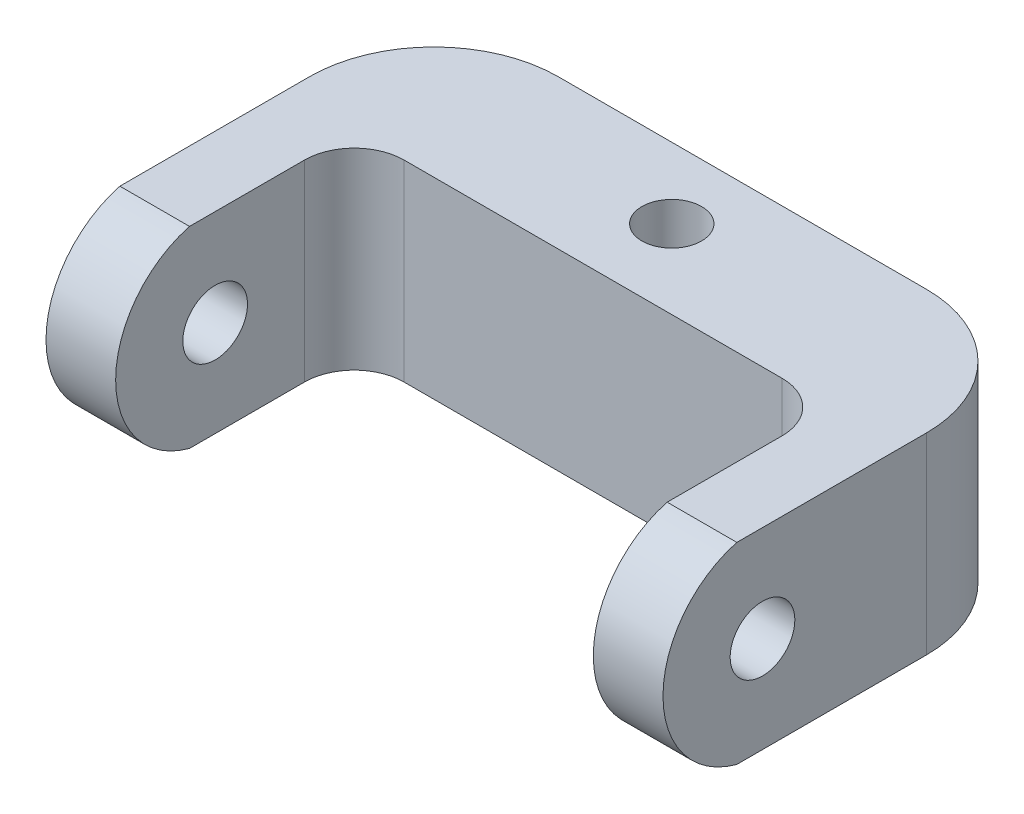
ISO-10303-21;
HEADER;
FILE_DESCRIPTION(('STEP AP214'),'2;1');
FILE_NAME('part.step','',(''),(''),'','','');
FILE_SCHEMA(('AUTOMOTIVE_DESIGN { 1 0 10303 214 1 1 1 1 }'));
ENDSEC;
DATA;
#1=APPLICATION_CONTEXT('core data for automotive mechanical design processes');
#2=APPLICATION_PROTOCOL_DEFINITION('international standard','automotive_design',2000,#1);
#3=PRODUCT_CONTEXT('',#1,'mechanical');
#4=PRODUCT('Part','Part','',(#3));
#5=PRODUCT_RELATED_PRODUCT_CATEGORY('part','',(#4));
#6=PRODUCT_DEFINITION_FORMATION('','',#4);
#7=PRODUCT_DEFINITION_CONTEXT('part definition',#1,'design');
#8=PRODUCT_DEFINITION('design','',#6,#7);
#9=PRODUCT_DEFINITION_SHAPE('','',#8);
#10=(LENGTH_UNIT() NAMED_UNIT(*) SI_UNIT(.MILLI.,.METRE.));
#11=(NAMED_UNIT(*) PLANE_ANGLE_UNIT() SI_UNIT($,.RADIAN.));
#12=(NAMED_UNIT(*) SI_UNIT($,.STERADIAN.) SOLID_ANGLE_UNIT());
#13=UNCERTAINTY_MEASURE_WITH_UNIT(LENGTH_MEASURE(1.E-05),#10,'distance_accuracy_value','');
#14=(GEOMETRIC_REPRESENTATION_CONTEXT(3) GLOBAL_UNCERTAINTY_ASSIGNED_CONTEXT((#13)) GLOBAL_UNIT_ASSIGNED_CONTEXT((#10,
#11,#12)) REPRESENTATION_CONTEXT('',''));
#15=CARTESIAN_POINT('',(0.,0.,0.));
#16=DIRECTION('',(0.,0.,1.));
#17=DIRECTION('',(1.,0.,0.));
#18=AXIS2_PLACEMENT_3D('',#15,#16,#17);
#19=CARTESIAN_POINT('',(21.,88.6760866086448,9.55618540610377));
#20=DIRECTION('',(0.,-1.,0.));
#21=DIRECTION('',(0.,0.,-1.));
#22=AXIS2_PLACEMENT_3D('',#19,#20,#21);
#23=PLANE('',#22);
#24=CARTESIAN_POINT('',(-3.,88.6760866086448,-14.9032500194833));
#25=DIRECTION('',(0.,1.,0.));
#26=DIRECTION('',(-1.,0.,0.));
#27=AXIS2_PLACEMENT_3D('',#24,#25,#26);
#28=CIRCLE('',#27,3.);
#29=CARTESIAN_POINT('',(0.,88.6760866086448,-14.9032500194833));
#30=VERTEX_POINT('',#29);
#31=EDGE_CURVE('E169',#30,#30,#28,.T.);
#32=ORIENTED_EDGE('',*,*,#31,.T.);
#33=EDGE_LOOP('',(#32));
#34=FACE_BOUND('',#33,.T.);
#35=CARTESIAN_POINT('',(-21.5,88.6760866086448,-9.50000010430813));
#36=DIRECTION('',(0.,1.,0.));
#37=DIRECTION('',(-0.707106781186548,0.,-0.707106781186548));
#38=AXIS2_PLACEMENT_3D('',#35,#36,#37);
#39=CIRCLE('',#38,12.5);
#40=CARTESIAN_POINT('',(-21.5,88.6760866086448,-22.0000001043081));
#41=VERTEX_POINT('',#40);
#42=CARTESIAN_POINT('',(-34.,88.6760866086448,-9.50000010430813));
#43=VERTEX_POINT('',#42);
#44=EDGE_CURVE('E162',#41,#43,#39,.T.);
#45=ORIENTED_EDGE('',*,*,#44,.F.);
#46=DIRECTION('',(1.,0.,0.));
#47=VECTOR('',#46,1.);
#48=CARTESIAN_POINT('',(21.,88.6760866086448,-22.0000001043081));
#49=LINE('',#48,#47);
#50=CARTESIAN_POINT('',(15.5,88.6760866086448,-22.0000001043081));
#51=VERTEX_POINT('',#50);
#52=EDGE_CURVE('E154',#41,#51,#49,.T.);
#53=ORIENTED_EDGE('',*,*,#52,.T.);
#54=CARTESIAN_POINT('',(15.5,88.6760866086448,-9.50000010430813));
#55=DIRECTION('',(0.,1.,0.));
#56=DIRECTION('',(0.707106781186548,0.,-0.707106781186548));
#57=AXIS2_PLACEMENT_3D('',#54,#55,#56);
#58=CIRCLE('',#57,12.5);
#59=CARTESIAN_POINT('',(28.,88.6760866086448,-9.50000010430813));
#60=VERTEX_POINT('',#59);
#61=EDGE_CURVE('E252',#60,#51,#58,.T.);
#62=ORIENTED_EDGE('',*,*,#61,.F.);
#63=DIRECTION('',(0.,0.,-1.));
#64=VECTOR('',#63,1.);
#65=CARTESIAN_POINT('',(28.,88.6760866086448,7.27261511207016));
#66=LINE('',#65,#64);
#67=CARTESIAN_POINT('',(28.,88.6760866086448,9.55618540610377));
#68=VERTEX_POINT('',#67);
#69=EDGE_CURVE('E113',#68,#60,#66,.T.);
#70=ORIENTED_EDGE('',*,*,#69,.F.);
#71=DIRECTION('',(1.,0.,0.));
#72=VECTOR('',#71,1.);
#73=CARTESIAN_POINT('',(21.,88.6760866086448,9.55618540610377));
#74=LINE('',#73,#72);
#75=CARTESIAN_POINT('',(21.,88.6760866086448,9.55618540610377));
#76=VERTEX_POINT('',#75);
#77=EDGE_CURVE('E46',#76,#68,#74,.T.);
#78=ORIENTED_EDGE('',*,*,#77,.F.);
#79=DIRECTION('',(0.,0.,1.));
#80=VECTOR('',#79,1.);
#81=CARTESIAN_POINT('',(21.,88.6760866086448,-7.00000010430813));
#82=LINE('',#81,#80);
#83=CARTESIAN_POINT('',(21.,88.6760866086448,-2.00000010430813));
#84=VERTEX_POINT('',#83);
#85=EDGE_CURVE('E227',#84,#76,#82,.T.);
#86=ORIENTED_EDGE('',*,*,#85,.F.);
#87=CARTESIAN_POINT('',(16.,88.6760866086448,-2.00000010430813));
#88=DIRECTION('',(0.,-1.,0.));
#89=DIRECTION('',(0.707106781186548,0.,-0.707106781186548));
#90=AXIS2_PLACEMENT_3D('',#87,#88,#89);
#91=CIRCLE('',#90,5.);
#92=CARTESIAN_POINT('',(16.,88.6760866086448,-7.00000010430813));
#93=VERTEX_POINT('',#92);
#94=EDGE_CURVE('E187',#93,#84,#91,.T.);
#95=ORIENTED_EDGE('',*,*,#94,.F.);
#96=DIRECTION('',(-1.,0.,0.));
#97=VECTOR('',#96,1.);
#98=CARTESIAN_POINT('',(9.,88.6760866086448,-7.00000010430813));
#99=LINE('',#98,#97);
#100=CARTESIAN_POINT('',(-22.,88.6760866086448,-7.00000010430813));
#101=VERTEX_POINT('',#100);
#102=EDGE_CURVE('E203',#93,#101,#99,.T.);
#103=ORIENTED_EDGE('',*,*,#102,.T.);
#104=CARTESIAN_POINT('',(-22.,88.6760866086448,-2.00000010430813));
#105=DIRECTION('',(0.,-1.,0.));
#106=DIRECTION('',(-0.707106781186548,0.,-0.707106781186548));
#107=AXIS2_PLACEMENT_3D('',#104,#105,#106);
#108=CIRCLE('',#107,5.);
#109=CARTESIAN_POINT('',(-27.,88.6760866086448,-2.00000010430813));
#110=VERTEX_POINT('',#109);
#111=EDGE_CURVE('E243',#110,#101,#108,.T.);
#112=ORIENTED_EDGE('',*,*,#111,.F.);
#113=DIRECTION('',(0.,0.,1.));
#114=VECTOR('',#113,1.);
#115=CARTESIAN_POINT('',(-27.,88.6760866086448,-7.00000010430813));
#116=LINE('',#115,#114);
#117=CARTESIAN_POINT('',(-27.,88.6760866086448,9.55618540610377));
#118=VERTEX_POINT('',#117);
#119=EDGE_CURVE('E181',#110,#118,#116,.T.);
#120=ORIENTED_EDGE('',*,*,#119,.T.);
#121=DIRECTION('',(-1.,0.,0.));
#122=VECTOR('',#121,1.);
#123=CARTESIAN_POINT('',(-27.,88.6760866086448,9.55618540610377));
#124=LINE('',#123,#122);
#125=CARTESIAN_POINT('',(-34.,88.6760866086448,9.55618540610377));
#126=VERTEX_POINT('',#125);
#127=EDGE_CURVE('E205',#118,#126,#124,.T.);
#128=ORIENTED_EDGE('',*,*,#127,.T.);
#129=DIRECTION('',(0.,0.,-1.));
#130=VECTOR('',#129,1.);
#131=CARTESIAN_POINT('',(-34.,88.6760866086448,7.27261511207016));
#132=LINE('',#131,#130);
#133=EDGE_CURVE('E228',#126,#43,#132,.T.);
#134=ORIENTED_EDGE('',*,*,#133,.T.);
#135=EDGE_LOOP('',(#45,#53,#62,#70,#78,#86,#95,#103,#112,#120,#128,#134));
#136=FACE_BOUND('',#135,.T.);
#137=ADVANCED_FACE('F36',(#34,#136),#23,.T.);
#138=CARTESIAN_POINT('',(21.,98.3380441089851,6.97808974038122));
#139=DIRECTION('',(1.,0.,0.));
#140=DIRECTION('',(0.,1.,0.));
#141=AXIS2_PLACEMENT_3D('',#138,#139,#140);
#142=CYLINDRICAL_SURFACE('',#141,3.25);
#143=CARTESIAN_POINT('',(28.,98.3380441089851,6.97808974038122));
#144=DIRECTION('',(-1.,0.,0.));
#145=DIRECTION('',(0.,1.,0.));
#146=AXIS2_PLACEMENT_3D('',#143,#144,#145);
#147=CIRCLE('',#146,3.25);
#148=CARTESIAN_POINT('',(28.,95.0880441089851,6.97808974038122));
#149=VERTEX_POINT('',#148);
#150=EDGE_CURVE('E40',#149,#149,#147,.T.);
#151=ORIENTED_EDGE('',*,*,#150,.F.);
#152=DIRECTION('',(-1.,0.,0.));
#153=VECTOR('',#152,1.);
#154=CARTESIAN_POINT('',(21.,95.0880441089851,6.97808974038122));
#155=LINE('',#154,#153);
#156=CARTESIAN_POINT('',(21.,95.0880441089851,6.97808974038122));
#157=VERTEX_POINT('',#156);
#158=EDGE_CURVE('E11',#149,#157,#155,.T.);
#159=ORIENTED_EDGE('',*,*,#158,.T.);
#160=CARTESIAN_POINT('',(21.,98.3380441089851,6.97808974038122));
#161=DIRECTION('',(-1.,0.,0.));
#162=DIRECTION('',(0.,1.,0.));
#163=AXIS2_PLACEMENT_3D('',#160,#161,#162);
#164=CIRCLE('',#163,3.25);
#165=EDGE_CURVE('E226',#157,#157,#164,.T.);
#166=ORIENTED_EDGE('',*,*,#165,.T.);
#167=ORIENTED_EDGE('',*,*,#158,.F.);
#168=EDGE_LOOP('',(#151,#159,#166,#167));
#169=FACE_BOUND('',#168,.T.);
#170=ADVANCED_FACE('F303',(#169),#142,.F.);
#171=CARTESIAN_POINT('',(21.,98.3380441089851,6.97808974038122));
#172=DIRECTION('',(1.,0.,0.));
#173=DIRECTION('',(0.,1.,0.));
#174=AXIS2_PLACEMENT_3D('',#171,#172,#173);
#175=CYLINDRICAL_SURFACE('',#174,10.);
#176=CARTESIAN_POINT('',(21.,98.3380441089851,6.97808974038122));
#177=DIRECTION('',(1.,0.,0.));
#178=DIRECTION('',(0.,1.,0.));
#179=AXIS2_PLACEMENT_3D('',#176,#177,#178);
#180=CIRCLE('',#179,10.);
#181=CARTESIAN_POINT('',(21.,108.000001609325,9.55618540610376));
#182=VERTEX_POINT('',#181);
#183=EDGE_CURVE('E223',#182,#76,#180,.T.);
#184=ORIENTED_EDGE('',*,*,#183,.T.);
#185=ORIENTED_EDGE('',*,*,#77,.T.);
#186=CARTESIAN_POINT('',(28.,98.3380441089851,6.97808974038122));
#187=DIRECTION('',(1.,0.,0.));
#188=DIRECTION('',(0.,1.,0.));
#189=AXIS2_PLACEMENT_3D('',#186,#187,#188);
#190=CIRCLE('',#189,10.);
#191=CARTESIAN_POINT('',(28.,108.000001609325,9.55618540610376));
#192=VERTEX_POINT('',#191);
#193=EDGE_CURVE('E124',#192,#68,#190,.T.);
#194=ORIENTED_EDGE('',*,*,#193,.F.);
#195=DIRECTION('',(1.,0.,0.));
#196=VECTOR('',#195,1.);
#197=CARTESIAN_POINT('',(21.,108.000001609325,9.55618540610376));
#198=LINE('',#197,#196);
#199=EDGE_CURVE('E184',#182,#192,#198,.T.);
#200=ORIENTED_EDGE('',*,*,#199,.F.);
#201=EDGE_LOOP('',(#184,#185,#194,#200));
#202=FACE_BOUND('',#201,.T.);
#203=ADVANCED_FACE('F286',(#202),#175,.T.);
#204=CARTESIAN_POINT('',(-3.,98.3380441089851,-7.00000010430813));
#205=DIRECTION('',(0.,0.,-1.));
#206=DIRECTION('',(0.,-1.,0.));
#207=AXIS2_PLACEMENT_3D('',#204,#205,#206);
#208=PLANE('',#207);
#209=DIRECTION('',(0.,-1.,0.));
#210=VECTOR('',#209,1.);
#211=CARTESIAN_POINT('',(16.,98.3380441089851,-7.00000010430813));
#212=LINE('',#211,#210);
#213=CARTESIAN_POINT('',(16.,108.000001609325,-7.00000010430813));
#214=VERTEX_POINT('',#213);
#215=EDGE_CURVE('E197',#214,#93,#212,.T.);
#216=ORIENTED_EDGE('',*,*,#215,.F.);
#217=DIRECTION('',(1.,0.,0.));
#218=VECTOR('',#217,1.);
#219=CARTESIAN_POINT('',(9.,108.000001609325,-7.00000010430813));
#220=LINE('',#219,#218);
#221=CARTESIAN_POINT('',(-22.,108.000001609325,-7.00000010430813));
#222=VERTEX_POINT('',#221);
#223=EDGE_CURVE('E217',#222,#214,#220,.T.);
#224=ORIENTED_EDGE('',*,*,#223,.F.);
#225=DIRECTION('',(0.,1.,0.));
#226=VECTOR('',#225,1.);
#227=CARTESIAN_POINT('',(-22.,98.3380441089851,-7.00000010430813));
#228=LINE('',#227,#226);
#229=EDGE_CURVE('E176',#101,#222,#228,.T.);
#230=ORIENTED_EDGE('',*,*,#229,.F.);
#231=ORIENTED_EDGE('',*,*,#102,.F.);
#232=EDGE_LOOP('',(#216,#224,#230,#231));
#233=FACE_BOUND('',#232,.T.);
#234=ADVANCED_FACE('F278',(#233),#208,.F.);
#235=CARTESIAN_POINT('',(-27.,98.3380441089851,6.97808974038122));
#236=DIRECTION('',(1.,0.,0.));
#237=DIRECTION('',(0.,1.,0.));
#238=AXIS2_PLACEMENT_3D('',#235,#236,#237);
#239=CYLINDRICAL_SURFACE('',#238,3.25);
#240=CARTESIAN_POINT('',(-34.,98.3380441089851,6.97808974038122));
#241=DIRECTION('',(-1.,0.,0.));
#242=DIRECTION('',(0.,1.,0.));
#243=AXIS2_PLACEMENT_3D('',#240,#241,#242);
#244=CIRCLE('',#243,3.25);
#245=CARTESIAN_POINT('',(-34.,95.0880441089851,6.97808974038122));
#246=VERTEX_POINT('',#245);
#247=EDGE_CURVE('E191',#246,#246,#244,.T.);
#248=ORIENTED_EDGE('',*,*,#247,.T.);
#249=DIRECTION('',(1.,0.,0.));
#250=VECTOR('',#249,1.);
#251=CARTESIAN_POINT('',(-27.,95.0880441089851,6.97808974038122));
#252=LINE('',#251,#250);
#253=CARTESIAN_POINT('',(-27.,95.0880441089851,6.97808974038122));
#254=VERTEX_POINT('',#253);
#255=EDGE_CURVE('E55',#246,#254,#252,.T.);
#256=ORIENTED_EDGE('',*,*,#255,.T.);
#257=CARTESIAN_POINT('',(-27.,98.3380441089851,6.97808974038122));
#258=DIRECTION('',(-1.,0.,0.));
#259=DIRECTION('',(0.,1.,0.));
#260=AXIS2_PLACEMENT_3D('',#257,#258,#259);
#261=CIRCLE('',#260,3.25);
#262=EDGE_CURVE('E201',#254,#254,#261,.T.);
#263=ORIENTED_EDGE('',*,*,#262,.F.);
#264=ORIENTED_EDGE('',*,*,#255,.F.);
#265=EDGE_LOOP('',(#248,#256,#263,#264));
#266=FACE_BOUND('',#265,.T.);
#267=ADVANCED_FACE('F319',(#266),#239,.F.);
#268=CARTESIAN_POINT('',(-27.,98.3380441089851,6.97808974038122));
#269=DIRECTION('',(1.,0.,0.));
#270=DIRECTION('',(0.,1.,0.));
#271=AXIS2_PLACEMENT_3D('',#268,#269,#270);
#272=CYLINDRICAL_SURFACE('',#271,10.);
#273=CARTESIAN_POINT('',(-27.,98.3380441089851,6.97808974038122));
#274=DIRECTION('',(1.,0.,0.));
#275=DIRECTION('',(0.,1.,0.));
#276=AXIS2_PLACEMENT_3D('',#273,#274,#275);
#277=CIRCLE('',#276,10.);
#278=CARTESIAN_POINT('',(-27.,108.000001609325,9.55618540610376));
#279=VERTEX_POINT('',#278);
#280=EDGE_CURVE('E178',#279,#118,#277,.T.);
#281=ORIENTED_EDGE('',*,*,#280,.F.);
#282=DIRECTION('',(-1.,0.,0.));
#283=VECTOR('',#282,1.);
#284=CARTESIAN_POINT('',(-27.,108.000001609325,9.55618540610376));
#285=LINE('',#284,#283);
#286=CARTESIAN_POINT('',(-34.,108.000001609325,9.55618540610376));
#287=VERTEX_POINT('',#286);
#288=EDGE_CURVE('E153',#279,#287,#285,.T.);
#289=ORIENTED_EDGE('',*,*,#288,.T.);
#290=CARTESIAN_POINT('',(-34.,98.3380441089851,6.97808974038122));
#291=DIRECTION('',(1.,0.,0.));
#292=DIRECTION('',(0.,1.,0.));
#293=AXIS2_PLACEMENT_3D('',#290,#291,#292);
#294=CIRCLE('',#293,10.);
#295=EDGE_CURVE('E148',#287,#126,#294,.T.);
#296=ORIENTED_EDGE('',*,*,#295,.T.);
#297=ORIENTED_EDGE('',*,*,#127,.F.);
#298=EDGE_LOOP('',(#281,#289,#296,#297));
#299=FACE_BOUND('',#298,.T.);
#300=ADVANCED_FACE('F322',(#299),#272,.T.);
#301=CARTESIAN_POINT('',(-27.,98.3380441089851,4.98904481803654));
#302=DIRECTION('',(1.,0.,0.));
#303=DIRECTION('',(0.,1.,0.));
#304=AXIS2_PLACEMENT_3D('',#301,#302,#303);
#305=PLANE('',#304);
#306=ORIENTED_EDGE('',*,*,#262,.T.);
#307=EDGE_LOOP('',(#306));
#308=FACE_BOUND('',#307,.T.);
#309=DIRECTION('',(0.,-1.,0.));
#310=VECTOR('',#309,1.);
#311=CARTESIAN_POINT('',(-27.,98.3380441089851,-2.00000010430813));
#312=LINE('',#311,#310);
#313=CARTESIAN_POINT('',(-27.,108.000001609325,-2.00000010430813));
#314=VERTEX_POINT('',#313);
#315=EDGE_CURVE('E246',#314,#110,#312,.T.);
#316=ORIENTED_EDGE('',*,*,#315,.F.);
#317=DIRECTION('',(0.,0.,-1.));
#318=VECTOR('',#317,1.);
#319=CARTESIAN_POINT('',(-27.,108.000001609325,20.9561795850706));
#320=LINE('',#319,#318);
#321=EDGE_CURVE('E236',#279,#314,#320,.T.);
#322=ORIENTED_EDGE('',*,*,#321,.F.);
#323=ORIENTED_EDGE('',*,*,#280,.T.);
#324=ORIENTED_EDGE('',*,*,#119,.F.);
#325=EDGE_LOOP('',(#316,#322,#323,#324));
#326=FACE_BOUND('',#325,.T.);
#327=ADVANCED_FACE('F270',(#308,#326),#305,.T.);
#328=CARTESIAN_POINT('',(-22.,98.3380441089851,-2.00000010430813));
#329=DIRECTION('',(0.,-1.,0.));
#330=DIRECTION('',(-0.707106781186548,0.,-0.707106781186548));
#331=AXIS2_PLACEMENT_3D('',#328,#329,#330);
#332=CYLINDRICAL_SURFACE('',#331,5.);
#333=CARTESIAN_POINT('',(-22.,108.000001609325,-2.00000010430813));
#334=DIRECTION('',(0.,1.,0.));
#335=DIRECTION('',(-0.707106781186548,0.,-0.707106781186548));
#336=AXIS2_PLACEMENT_3D('',#333,#334,#335);
#337=CIRCLE('',#336,5.);
#338=EDGE_CURVE('E220',#222,#314,#337,.T.);
#339=ORIENTED_EDGE('',*,*,#338,.T.);
#340=ORIENTED_EDGE('',*,*,#315,.T.);
#341=ORIENTED_EDGE('',*,*,#111,.T.);
#342=ORIENTED_EDGE('',*,*,#229,.T.);
#343=EDGE_LOOP('',(#339,#340,#341,#342));
#344=FACE_BOUND('',#343,.T.);
#345=ADVANCED_FACE('F272',(#344),#332,.F.);
#346=CARTESIAN_POINT('',(21.,98.3380441089851,4.98904481803654));
#347=DIRECTION('',(1.,0.,0.));
#348=DIRECTION('',(0.,1.,0.));
#349=AXIS2_PLACEMENT_3D('',#346,#347,#348);
#350=PLANE('',#349);
#351=ORIENTED_EDGE('',*,*,#165,.F.);
#352=EDGE_LOOP('',(#351));
#353=FACE_BOUND('',#352,.T.);
#354=DIRECTION('',(0.,1.,0.));
#355=VECTOR('',#354,1.);
#356=CARTESIAN_POINT('',(21.,98.3380441089851,-2.00000010430813));
#357=LINE('',#356,#355);
#358=CARTESIAN_POINT('',(21.,108.000001609325,-2.00000010430813));
#359=VERTEX_POINT('',#358);
#360=EDGE_CURVE('E190',#84,#359,#357,.T.);
#361=ORIENTED_EDGE('',*,*,#360,.F.);
#362=ORIENTED_EDGE('',*,*,#85,.T.);
#363=ORIENTED_EDGE('',*,*,#183,.F.);
#364=DIRECTION('',(0.,0.,-1.));
#365=VECTOR('',#364,1.);
#366=CARTESIAN_POINT('',(21.,108.000001609325,20.9561795850706));
#367=LINE('',#366,#365);
#368=EDGE_CURVE('E182',#182,#359,#367,.T.);
#369=ORIENTED_EDGE('',*,*,#368,.T.);
#370=EDGE_LOOP('',(#361,#362,#363,#369));
#371=FACE_BOUND('',#370,.T.);
#372=ADVANCED_FACE('F285',(#353,#371),#350,.F.);
#373=CARTESIAN_POINT('',(16.,98.3380441089851,-2.00000010430813));
#374=DIRECTION('',(0.,1.,0.));
#375=DIRECTION('',(0.707106781186548,0.,-0.707106781186548));
#376=AXIS2_PLACEMENT_3D('',#373,#374,#375);
#377=CYLINDRICAL_SURFACE('',#376,5.);
#378=ORIENTED_EDGE('',*,*,#94,.T.);
#379=ORIENTED_EDGE('',*,*,#360,.T.);
#380=CARTESIAN_POINT('',(16.,108.000001609325,-2.00000010430813));
#381=DIRECTION('',(0.,1.,0.));
#382=DIRECTION('',(0.707106781186548,0.,-0.707106781186548));
#383=AXIS2_PLACEMENT_3D('',#380,#381,#382);
#384=CIRCLE('',#383,5.);
#385=EDGE_CURVE('E185',#359,#214,#384,.T.);
#386=ORIENTED_EDGE('',*,*,#385,.T.);
#387=ORIENTED_EDGE('',*,*,#215,.T.);
#388=EDGE_LOOP('',(#378,#379,#386,#387));
#389=FACE_BOUND('',#388,.T.);
#390=ADVANCED_FACE('F282',(#389),#377,.F.);
#391=CARTESIAN_POINT('',(-34.,98.3380441089851,4.98904481803654));
#392=DIRECTION('',(1.,0.,0.));
#393=DIRECTION('',(0.,1.,0.));
#394=AXIS2_PLACEMENT_3D('',#391,#392,#393);
#395=PLANE('',#394);
#396=ORIENTED_EDGE('',*,*,#247,.F.);
#397=EDGE_LOOP('',(#396));
#398=FACE_BOUND('',#397,.T.);
#399=DIRECTION('',(0.,1.,0.));
#400=VECTOR('',#399,1.);
#401=CARTESIAN_POINT('',(-34.,93.5070653588149,-9.50000010430813));
#402=LINE('',#401,#400);
#403=CARTESIAN_POINT('',(-34.,108.000001609325,-9.50000010430813));
#404=VERTEX_POINT('',#403);
#405=EDGE_CURVE('E145',#43,#404,#402,.T.);
#406=ORIENTED_EDGE('',*,*,#405,.F.);
#407=ORIENTED_EDGE('',*,*,#133,.F.);
#408=ORIENTED_EDGE('',*,*,#295,.F.);
#409=DIRECTION('',(0.,0.,1.));
#410=VECTOR('',#409,1.);
#411=CARTESIAN_POINT('',(-34.,108.000001609325,-1.00547764313579));
#412=LINE('',#411,#410);
#413=EDGE_CURVE('E141',#404,#287,#412,.T.);
#414=ORIENTED_EDGE('',*,*,#413,.F.);
#415=EDGE_LOOP('',(#406,#407,#408,#414));
#416=FACE_BOUND('',#415,.T.);
#417=ADVANCED_FACE('F143',(#398,#416),#395,.F.);
#418=CARTESIAN_POINT('',(28.,98.3380441089851,4.98904481803654));
#419=DIRECTION('',(1.,0.,0.));
#420=DIRECTION('',(0.,1.,0.));
#421=AXIS2_PLACEMENT_3D('',#418,#419,#420);
#422=PLANE('',#421);
#423=ORIENTED_EDGE('',*,*,#150,.T.);
#424=EDGE_LOOP('',(#423));
#425=FACE_BOUND('',#424,.T.);
#426=DIRECTION('',(0.,-1.,0.));
#427=VECTOR('',#426,1.);
#428=CARTESIAN_POINT('',(28.,93.5070653588149,-9.50000010430813));
#429=LINE('',#428,#427);
#430=CARTESIAN_POINT('',(28.,108.000001609325,-9.50000010430813));
#431=VERTEX_POINT('',#430);
#432=EDGE_CURVE('E117',#431,#60,#429,.T.);
#433=ORIENTED_EDGE('',*,*,#432,.F.);
#434=DIRECTION('',(0.,0.,1.));
#435=VECTOR('',#434,1.);
#436=CARTESIAN_POINT('',(28.,108.000001609325,-1.00547764313579));
#437=LINE('',#436,#435);
#438=EDGE_CURVE('E194',#431,#192,#437,.T.);
#439=ORIENTED_EDGE('',*,*,#438,.T.);
#440=ORIENTED_EDGE('',*,*,#193,.T.);
#441=ORIENTED_EDGE('',*,*,#69,.T.);
#442=EDGE_LOOP('',(#433,#439,#440,#441));
#443=FACE_BOUND('',#442,.T.);
#444=ADVANCED_FACE('F288',(#425,#443),#422,.T.);
#445=CARTESIAN_POINT('',(15.5,93.5070653588149,-9.50000010430813));
#446=DIRECTION('',(0.,-1.,0.));
#447=DIRECTION('',(0.707106781186548,0.,-0.707106781186548));
#448=AXIS2_PLACEMENT_3D('',#445,#446,#447);
#449=CYLINDRICAL_SURFACE('',#448,12.5);
#450=ORIENTED_EDGE('',*,*,#61,.T.);
#451=DIRECTION('',(0.,1.,0.));
#452=VECTOR('',#451,1.);
#453=CARTESIAN_POINT('',(15.5,93.5070653588149,-22.0000001043081));
#454=LINE('',#453,#452);
#455=CARTESIAN_POINT('',(15.5,108.000001609325,-22.0000001043081));
#456=VERTEX_POINT('',#455);
#457=EDGE_CURVE('E214',#51,#456,#454,.T.);
#458=ORIENTED_EDGE('',*,*,#457,.T.);
#459=CARTESIAN_POINT('',(15.5,108.000001609325,-9.50000010430813));
#460=DIRECTION('',(0.,-1.,0.));
#461=DIRECTION('',(0.707106781186548,0.,-0.707106781186548));
#462=AXIS2_PLACEMENT_3D('',#459,#460,#461);
#463=CIRCLE('',#462,12.5);
#464=EDGE_CURVE('E199',#456,#431,#463,.T.);
#465=ORIENTED_EDGE('',*,*,#464,.T.);
#466=ORIENTED_EDGE('',*,*,#432,.T.);
#467=EDGE_LOOP('',(#450,#458,#465,#466));
#468=FACE_BOUND('',#467,.T.);
#469=ADVANCED_FACE('F290',(#468),#449,.T.);
#470=CARTESIAN_POINT('',(21.,108.000001609325,-7.00000010430813));
#471=DIRECTION('',(0.,1.,0.));
#472=DIRECTION('',(1.,0.,0.));
#473=AXIS2_PLACEMENT_3D('',#470,#471,#472);
#474=PLANE('',#473);
#475=CARTESIAN_POINT('',(-3.,108.000001609325,-14.9032500194833));
#476=DIRECTION('',(0.,-1.,0.));
#477=DIRECTION('',(-1.,0.,0.));
#478=AXIS2_PLACEMENT_3D('',#475,#476,#477);
#479=CIRCLE('',#478,3.);
#480=CARTESIAN_POINT('',(0.,108.000001609325,-14.9032500194833));
#481=VERTEX_POINT('',#480);
#482=EDGE_CURVE('E209',#481,#481,#479,.T.);
#483=ORIENTED_EDGE('',*,*,#482,.T.);
#484=EDGE_LOOP('',(#483));
#485=FACE_BOUND('',#484,.T.);
#486=CARTESIAN_POINT('',(-21.5,108.000001609325,-9.50000010430813));
#487=DIRECTION('',(0.,-1.,0.));
#488=DIRECTION('',(-0.707106781186548,0.,-0.707106781186548));
#489=AXIS2_PLACEMENT_3D('',#486,#487,#488);
#490=CIRCLE('',#489,12.5);
#491=CARTESIAN_POINT('',(-21.5,108.000001609325,-22.0000001043081));
#492=VERTEX_POINT('',#491);
#493=EDGE_CURVE('E160',#404,#492,#490,.T.);
#494=ORIENTED_EDGE('',*,*,#493,.F.);
#495=ORIENTED_EDGE('',*,*,#413,.T.);
#496=ORIENTED_EDGE('',*,*,#288,.F.);
#497=ORIENTED_EDGE('',*,*,#321,.T.);
#498=ORIENTED_EDGE('',*,*,#338,.F.);
#499=ORIENTED_EDGE('',*,*,#223,.T.);
#500=ORIENTED_EDGE('',*,*,#385,.F.);
#501=ORIENTED_EDGE('',*,*,#368,.F.);
#502=ORIENTED_EDGE('',*,*,#199,.T.);
#503=ORIENTED_EDGE('',*,*,#438,.F.);
#504=ORIENTED_EDGE('',*,*,#464,.F.);
#505=DIRECTION('',(-1.,0.,0.));
#506=VECTOR('',#505,1.);
#507=CARTESIAN_POINT('',(21.,108.000001609325,-22.0000001043081));
#508=LINE('',#507,#506);
#509=EDGE_CURVE('E163',#456,#492,#508,.T.);
#510=ORIENTED_EDGE('',*,*,#509,.T.);
#511=EDGE_LOOP('',(#494,#495,#496,#497,#498,#499,#500,#501,#502,#503,#504,#510));
#512=FACE_BOUND('',#511,.T.);
#513=ADVANCED_FACE('F38',(#485,#512),#474,.T.);
#514=CARTESIAN_POINT('',(21.,88.6760866086448,-22.0000001043081));
#515=DIRECTION('',(0.,0.,-1.));
#516=DIRECTION('',(0.,-1.,0.));
#517=AXIS2_PLACEMENT_3D('',#514,#515,#516);
#518=PLANE('',#517);
#519=DIRECTION('',(0.,-1.,0.));
#520=VECTOR('',#519,1.);
#521=CARTESIAN_POINT('',(-21.5,93.5070653588149,-22.0000001043081));
#522=LINE('',#521,#520);
#523=EDGE_CURVE('E168',#492,#41,#522,.T.);
#524=ORIENTED_EDGE('',*,*,#523,.F.);
#525=ORIENTED_EDGE('',*,*,#509,.F.);
#526=ORIENTED_EDGE('',*,*,#457,.F.);
#527=ORIENTED_EDGE('',*,*,#52,.F.);
#528=EDGE_LOOP('',(#524,#525,#526,#527));
#529=FACE_BOUND('',#528,.T.);
#530=ADVANCED_FACE('F313',(#529),#518,.T.);
#531=CARTESIAN_POINT('',(-21.5,93.5070653588149,-9.50000010430813));
#532=DIRECTION('',(0.,1.,0.));
#533=DIRECTION('',(-0.707106781186548,0.,-0.707106781186548));
#534=AXIS2_PLACEMENT_3D('',#531,#532,#533);
#535=CYLINDRICAL_SURFACE('',#534,12.5);
#536=ORIENTED_EDGE('',*,*,#493,.T.);
#537=ORIENTED_EDGE('',*,*,#523,.T.);
#538=ORIENTED_EDGE('',*,*,#44,.T.);
#539=ORIENTED_EDGE('',*,*,#405,.T.);
#540=EDGE_LOOP('',(#536,#537,#538,#539));
#541=FACE_BOUND('',#540,.T.);
#542=ADVANCED_FACE('F158',(#541),#535,.T.);
#543=CARTESIAN_POINT('',(-3.,108.000001609325,-14.9032500194833));
#544=DIRECTION('',(0.,-1.,0.));
#545=DIRECTION('',(-1.,0.,0.));
#546=AXIS2_PLACEMENT_3D('',#543,#544,#545);
#547=CYLINDRICAL_SURFACE('',#546,3.);
#548=ORIENTED_EDGE('',*,*,#482,.F.);
#549=DIRECTION('',(0.,-1.,0.));
#550=VECTOR('',#549,1.);
#551=CARTESIAN_POINT('',(0.,108.000001609325,-14.9032500194833));
#552=LINE('',#551,#550);
#553=EDGE_CURVE('E172',#481,#30,#552,.T.);
#554=ORIENTED_EDGE('',*,*,#553,.T.);
#555=ORIENTED_EDGE('',*,*,#31,.F.);
#556=ORIENTED_EDGE('',*,*,#553,.F.);
#557=EDGE_LOOP('',(#548,#554,#555,#556));
#558=FACE_BOUND('',#557,.T.);
#559=ADVANCED_FACE('F343',(#558),#547,.F.);
#560=CLOSED_SHELL('',(#137,#170,#203,#234,#267,#300,#327,#345,#372,#390,#417,#444,#469,#513,
#530,#542,#559));
#561=MANIFOLD_SOLID_BREP('B2',#560);
#562=ADVANCED_BREP_SHAPE_REPRESENTATION('',(#18,#561),#14);
#563=SHAPE_DEFINITION_REPRESENTATION(#9,#562);
ENDSEC;
END-ISO-10303-21;
